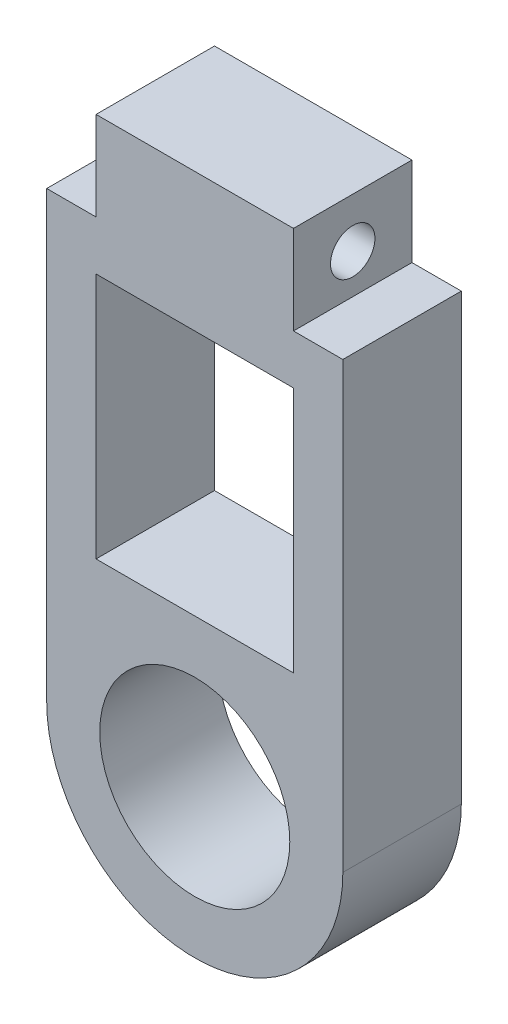
ISO-10303-21;
HEADER;
FILE_DESCRIPTION(('STEP AP214'),'2;1');
FILE_NAME('part.step','',(''),(''),'','','');
FILE_SCHEMA(('AUTOMOTIVE_DESIGN { 1 0 10303 214 1 1 1 1 }'));
ENDSEC;
DATA;
#1=APPLICATION_CONTEXT('core data for automotive mechanical design processes');
#2=APPLICATION_PROTOCOL_DEFINITION('international standard','automotive_design',2000,#1);
#3=PRODUCT_CONTEXT('',#1,'mechanical');
#4=PRODUCT('Part','Part','',(#3));
#5=PRODUCT_RELATED_PRODUCT_CATEGORY('part','',(#4));
#6=PRODUCT_DEFINITION_FORMATION('','',#4);
#7=PRODUCT_DEFINITION_CONTEXT('part definition',#1,'design');
#8=PRODUCT_DEFINITION('design','',#6,#7);
#9=PRODUCT_DEFINITION_SHAPE('','',#8);
#10=(LENGTH_UNIT() NAMED_UNIT(*) SI_UNIT(.MILLI.,.METRE.));
#11=(NAMED_UNIT(*) PLANE_ANGLE_UNIT() SI_UNIT($,.RADIAN.));
#12=(NAMED_UNIT(*) SI_UNIT($,.STERADIAN.) SOLID_ANGLE_UNIT());
#13=UNCERTAINTY_MEASURE_WITH_UNIT(LENGTH_MEASURE(1.E-05),#10,'distance_accuracy_value','');
#14=(GEOMETRIC_REPRESENTATION_CONTEXT(3) GLOBAL_UNCERTAINTY_ASSIGNED_CONTEXT((#13)) GLOBAL_UNIT_ASSIGNED_CONTEXT((#10,
#11,#12)) REPRESENTATION_CONTEXT('',''));
#15=CARTESIAN_POINT('',(0.,0.,0.));
#16=DIRECTION('',(0.,0.,1.));
#17=DIRECTION('',(1.,0.,0.));
#18=AXIS2_PLACEMENT_3D('',#15,#16,#17);
#19=CARTESIAN_POINT('',(0.,-47.5059057845326,12.));
#20=DIRECTION('',(0.,0.,1.));
#21=DIRECTION('',(1.,0.,0.));
#22=AXIS2_PLACEMENT_3D('',#19,#20,#21);
#23=PLANE('',#22);
#24=DIRECTION('',(1.,0.,0.));
#25=VECTOR('',#24,1.);
#26=CARTESIAN_POINT('',(-10.,-32.5059057845326,12.));
#27=LINE('',#26,#25);
#28=CARTESIAN_POINT('',(-10.,-32.5059057845326,12.));
#29=VERTEX_POINT('',#28);
#30=CARTESIAN_POINT('',(10.,-32.5059057845326,12.));
#31=VERTEX_POINT('',#30);
#32=EDGE_CURVE('E131',#29,#31,#27,.T.);
#33=ORIENTED_EDGE('',*,*,#32,.F.);
#34=DIRECTION('',(0.,-1.,0.));
#35=VECTOR('',#34,1.);
#36=CARTESIAN_POINT('',(-10.,-7.50590578453262,12.));
#37=LINE('',#36,#35);
#38=CARTESIAN_POINT('',(-10.,-7.50590578453262,12.));
#39=VERTEX_POINT('',#38);
#40=EDGE_CURVE('E123',#39,#29,#37,.T.);
#41=ORIENTED_EDGE('',*,*,#40,.F.);
#42=DIRECTION('',(-1.,0.,0.));
#43=VECTOR('',#42,1.);
#44=CARTESIAN_POINT('',(-10.,-7.50590578453262,12.));
#45=LINE('',#44,#43);
#46=CARTESIAN_POINT('',(10.,-7.50590578453262,12.));
#47=VERTEX_POINT('',#46);
#48=EDGE_CURVE('E146',#47,#39,#45,.T.);
#49=ORIENTED_EDGE('',*,*,#48,.F.);
#50=DIRECTION('',(0.,1.,0.));
#51=VECTOR('',#50,1.);
#52=CARTESIAN_POINT('',(10.,-7.50590578453262,12.));
#53=LINE('',#52,#51);
#54=EDGE_CURVE('E144',#31,#47,#53,.T.);
#55=ORIENTED_EDGE('',*,*,#54,.F.);
#56=EDGE_LOOP('',(#33,#41,#49,#55));
#57=FACE_BOUND('',#56,.T.);
#58=DIRECTION('',(-1.,0.,0.));
#59=VECTOR('',#58,1.);
#60=CARTESIAN_POINT('',(-15.,-2.50590578453262,12.));
#61=LINE('',#60,#59);
#62=CARTESIAN_POINT('',(-10.,-2.50590578453262,12.));
#63=VERTEX_POINT('',#62);
#64=CARTESIAN_POINT('',(-15.,-2.50590578453262,12.));
#65=VERTEX_POINT('',#64);
#66=EDGE_CURVE('E162',#63,#65,#61,.T.);
#67=ORIENTED_EDGE('',*,*,#66,.T.);
#68=DIRECTION('',(0.,-1.,0.));
#69=VECTOR('',#68,1.);
#70=CARTESIAN_POINT('',(-15.,-2.50590578453262,12.));
#71=LINE('',#70,#69);
#72=CARTESIAN_POINT('',(-15.,-47.5059057845326,12.));
#73=VERTEX_POINT('',#72);
#74=EDGE_CURVE('E165',#65,#73,#71,.T.);
#75=ORIENTED_EDGE('',*,*,#74,.T.);
#76=CARTESIAN_POINT('',(0.,-47.5059057845326,12.));
#77=DIRECTION('',(0.,0.,1.));
#78=DIRECTION('',(1.,0.,0.));
#79=AXIS2_PLACEMENT_3D('',#76,#77,#78);
#80=CIRCLE('',#79,15.);
#81=CARTESIAN_POINT('',(15.,-47.5059057845326,12.));
#82=VERTEX_POINT('',#81);
#83=EDGE_CURVE('E168',#73,#82,#80,.T.);
#84=ORIENTED_EDGE('',*,*,#83,.T.);
#85=DIRECTION('',(0.,1.,0.));
#86=VECTOR('',#85,1.);
#87=CARTESIAN_POINT('',(15.,-2.50590578453262,12.));
#88=LINE('',#87,#86);
#89=CARTESIAN_POINT('',(15.,-2.50590578453262,12.));
#90=VERTEX_POINT('',#89);
#91=EDGE_CURVE('E170',#82,#90,#88,.T.);
#92=ORIENTED_EDGE('',*,*,#91,.T.);
#93=DIRECTION('',(-1.,0.,0.));
#94=VECTOR('',#93,1.);
#95=CARTESIAN_POINT('',(10.,-2.50590578453262,12.));
#96=LINE('',#95,#94);
#97=CARTESIAN_POINT('',(10.,-2.50590578453262,12.));
#98=VERTEX_POINT('',#97);
#99=EDGE_CURVE('E172',#90,#98,#96,.T.);
#100=ORIENTED_EDGE('',*,*,#99,.T.);
#101=DIRECTION('',(0.,1.,0.));
#102=VECTOR('',#101,1.);
#103=CARTESIAN_POINT('',(10.,6.49409421546738,12.));
#104=LINE('',#103,#102);
#105=CARTESIAN_POINT('',(10.,6.49409421546738,12.));
#106=VERTEX_POINT('',#105);
#107=EDGE_CURVE('E174',#98,#106,#104,.T.);
#108=ORIENTED_EDGE('',*,*,#107,.T.);
#109=DIRECTION('',(-1.,0.,0.));
#110=VECTOR('',#109,1.);
#111=CARTESIAN_POINT('',(-10.,6.49409421546738,12.));
#112=LINE('',#111,#110);
#113=CARTESIAN_POINT('',(-10.,6.49409421546738,12.));
#114=VERTEX_POINT('',#113);
#115=EDGE_CURVE('E176',#106,#114,#112,.T.);
#116=ORIENTED_EDGE('',*,*,#115,.T.);
#117=DIRECTION('',(0.,-1.,0.));
#118=VECTOR('',#117,1.);
#119=CARTESIAN_POINT('',(-10.,-2.50590578453262,12.));
#120=LINE('',#119,#118);
#121=EDGE_CURVE('E178',#114,#63,#120,.T.);
#122=ORIENTED_EDGE('',*,*,#121,.T.);
#123=EDGE_LOOP('',(#67,#75,#84,#92,#100,#108,#116,#122));
#124=FACE_BOUND('',#123,.T.);
#125=CARTESIAN_POINT('',(0.,-47.5059057845326,12.));
#126=DIRECTION('',(0.,0.,1.));
#127=DIRECTION('',(1.,0.,0.));
#128=AXIS2_PLACEMENT_3D('',#125,#126,#127);
#129=CIRCLE('',#128,9.625);
#130=CARTESIAN_POINT('',(9.625,-47.5059057845326,12.));
#131=VERTEX_POINT('',#130);
#132=EDGE_CURVE('E152',#131,#131,#129,.T.);
#133=ORIENTED_EDGE('',*,*,#132,.F.);
#134=EDGE_LOOP('',(#133));
#135=FACE_BOUND('',#134,.T.);
#136=ADVANCED_FACE('F33',(#57,#124,#135),#23,.T.);
#137=CARTESIAN_POINT('',(0.,-47.5059057845326,0.));
#138=DIRECTION('',(0.,0.,1.));
#139=DIRECTION('',(1.,0.,0.));
#140=AXIS2_PLACEMENT_3D('',#137,#138,#139);
#141=PLANE('',#140);
#142=DIRECTION('',(-1.,0.,0.));
#143=VECTOR('',#142,1.);
#144=CARTESIAN_POINT('',(-15.,-2.50590578453262,0.));
#145=LINE('',#144,#143);
#146=CARTESIAN_POINT('',(-10.,-2.50590578453262,0.));
#147=VERTEX_POINT('',#146);
#148=CARTESIAN_POINT('',(-15.,-2.50590578453262,0.));
#149=VERTEX_POINT('',#148);
#150=EDGE_CURVE('E139',#147,#149,#145,.T.);
#151=ORIENTED_EDGE('',*,*,#150,.F.);
#152=DIRECTION('',(0.,-1.,0.));
#153=VECTOR('',#152,1.);
#154=CARTESIAN_POINT('',(-10.,-2.50590578453262,0.));
#155=LINE('',#154,#153);
#156=CARTESIAN_POINT('',(-10.,6.49409421546738,0.));
#157=VERTEX_POINT('',#156);
#158=EDGE_CURVE('E166',#157,#147,#155,.T.);
#159=ORIENTED_EDGE('',*,*,#158,.F.);
#160=DIRECTION('',(-1.,0.,0.));
#161=VECTOR('',#160,1.);
#162=CARTESIAN_POINT('',(-10.,6.49409421546738,0.));
#163=LINE('',#162,#161);
#164=CARTESIAN_POINT('',(10.,6.49409421546738,0.));
#165=VERTEX_POINT('',#164);
#166=EDGE_CURVE('E193',#165,#157,#163,.T.);
#167=ORIENTED_EDGE('',*,*,#166,.F.);
#168=DIRECTION('',(0.,1.,0.));
#169=VECTOR('',#168,1.);
#170=CARTESIAN_POINT('',(10.,6.49409421546738,0.));
#171=LINE('',#170,#169);
#172=CARTESIAN_POINT('',(10.,-2.50590578453262,0.));
#173=VERTEX_POINT('',#172);
#174=EDGE_CURVE('E191',#173,#165,#171,.T.);
#175=ORIENTED_EDGE('',*,*,#174,.F.);
#176=DIRECTION('',(-1.,0.,0.));
#177=VECTOR('',#176,1.);
#178=CARTESIAN_POINT('',(10.,-2.50590578453262,0.));
#179=LINE('',#178,#177);
#180=CARTESIAN_POINT('',(15.,-2.50590578453262,0.));
#181=VERTEX_POINT('',#180);
#182=EDGE_CURVE('E189',#181,#173,#179,.T.);
#183=ORIENTED_EDGE('',*,*,#182,.F.);
#184=DIRECTION('',(0.,1.,0.));
#185=VECTOR('',#184,1.);
#186=CARTESIAN_POINT('',(15.,-2.50590578453262,0.));
#187=LINE('',#186,#185);
#188=CARTESIAN_POINT('',(15.,-47.5059057845326,0.));
#189=VERTEX_POINT('',#188);
#190=EDGE_CURVE('E187',#189,#181,#187,.T.);
#191=ORIENTED_EDGE('',*,*,#190,.F.);
#192=CARTESIAN_POINT('',(0.,-47.5059057845326,0.));
#193=DIRECTION('',(0.,0.,1.));
#194=DIRECTION('',(1.,0.,0.));
#195=AXIS2_PLACEMENT_3D('',#192,#193,#194);
#196=CIRCLE('',#195,15.);
#197=CARTESIAN_POINT('',(-15.,-47.5059057845326,0.));
#198=VERTEX_POINT('',#197);
#199=EDGE_CURVE('E185',#198,#189,#196,.T.);
#200=ORIENTED_EDGE('',*,*,#199,.F.);
#201=DIRECTION('',(0.,-1.,0.));
#202=VECTOR('',#201,1.);
#203=CARTESIAN_POINT('',(-15.,-2.50590578453262,0.));
#204=LINE('',#203,#202);
#205=EDGE_CURVE('E183',#149,#198,#204,.T.);
#206=ORIENTED_EDGE('',*,*,#205,.F.);
#207=EDGE_LOOP('',(#151,#159,#167,#175,#183,#191,#200,#206));
#208=FACE_BOUND('',#207,.T.);
#209=DIRECTION('',(0.,-1.,0.));
#210=VECTOR('',#209,1.);
#211=CARTESIAN_POINT('',(-10.,-7.50590578453262,0.));
#212=LINE('',#211,#210);
#213=CARTESIAN_POINT('',(-10.,-7.50590578453262,0.));
#214=VERTEX_POINT('',#213);
#215=CARTESIAN_POINT('',(-10.,-32.5059057845326,0.));
#216=VERTEX_POINT('',#215);
#217=EDGE_CURVE('E57',#214,#216,#212,.T.);
#218=ORIENTED_EDGE('',*,*,#217,.T.);
#219=DIRECTION('',(1.,0.,0.));
#220=VECTOR('',#219,1.);
#221=CARTESIAN_POINT('',(-10.,-32.5059057845326,0.));
#222=LINE('',#221,#220);
#223=CARTESIAN_POINT('',(10.,-32.5059057845326,0.));
#224=VERTEX_POINT('',#223);
#225=EDGE_CURVE('E138',#216,#224,#222,.T.);
#226=ORIENTED_EDGE('',*,*,#225,.T.);
#227=DIRECTION('',(0.,1.,0.));
#228=VECTOR('',#227,1.);
#229=CARTESIAN_POINT('',(10.,-7.50590578453262,0.));
#230=LINE('',#229,#228);
#231=CARTESIAN_POINT('',(10.,-7.50590578453262,0.));
#232=VERTEX_POINT('',#231);
#233=EDGE_CURVE('E154',#224,#232,#230,.T.);
#234=ORIENTED_EDGE('',*,*,#233,.T.);
#235=DIRECTION('',(-1.,0.,0.));
#236=VECTOR('',#235,1.);
#237=CARTESIAN_POINT('',(-10.,-7.50590578453262,0.));
#238=LINE('',#237,#236);
#239=EDGE_CURVE('E132',#232,#214,#238,.T.);
#240=ORIENTED_EDGE('',*,*,#239,.T.);
#241=EDGE_LOOP('',(#218,#226,#234,#240));
#242=FACE_BOUND('',#241,.T.);
#243=CARTESIAN_POINT('',(0.,-47.5059057845326,0.));
#244=DIRECTION('',(0.,0.,1.));
#245=DIRECTION('',(1.,0.,0.));
#246=AXIS2_PLACEMENT_3D('',#243,#244,#245);
#247=CIRCLE('',#246,9.625);
#248=CARTESIAN_POINT('',(9.625,-47.5059057845326,0.));
#249=VERTEX_POINT('',#248);
#250=EDGE_CURVE('E282',#249,#249,#247,.T.);
#251=ORIENTED_EDGE('',*,*,#250,.T.);
#252=EDGE_LOOP('',(#251));
#253=FACE_BOUND('',#252,.T.);
#254=ADVANCED_FACE('F224',(#208,#242,#253),#141,.F.);
#255=CARTESIAN_POINT('',(-15.,-2.50590578453262,12.));
#256=DIRECTION('',(0.,-1.,0.));
#257=DIRECTION('',(0.,0.,-1.));
#258=AXIS2_PLACEMENT_3D('',#255,#256,#257);
#259=PLANE('',#258);
#260=ORIENTED_EDGE('',*,*,#150,.T.);
#261=DIRECTION('',(0.,0.,-1.));
#262=VECTOR('',#261,1.);
#263=CARTESIAN_POINT('',(-15.,-2.50590578453262,12.));
#264=LINE('',#263,#262);
#265=EDGE_CURVE('E11',#65,#149,#264,.T.);
#266=ORIENTED_EDGE('',*,*,#265,.F.);
#267=ORIENTED_EDGE('',*,*,#66,.F.);
#268=DIRECTION('',(0.,0.,-1.));
#269=VECTOR('',#268,1.);
#270=CARTESIAN_POINT('',(-10.,-2.50590578453262,12.));
#271=LINE('',#270,#269);
#272=EDGE_CURVE('E180',#63,#147,#271,.T.);
#273=ORIENTED_EDGE('',*,*,#272,.T.);
#274=EDGE_LOOP('',(#260,#266,#267,#273));
#275=FACE_BOUND('',#274,.T.);
#276=ADVANCED_FACE('F35',(#275),#259,.F.);
#277=CARTESIAN_POINT('',(-15.,-2.50590578453262,12.));
#278=DIRECTION('',(1.,0.,0.));
#279=DIRECTION('',(0.,0.,-1.));
#280=AXIS2_PLACEMENT_3D('',#277,#278,#279);
#281=PLANE('',#280);
#282=ORIENTED_EDGE('',*,*,#205,.T.);
#283=DIRECTION('',(0.,0.,-1.));
#284=VECTOR('',#283,1.);
#285=CARTESIAN_POINT('',(-15.,-47.5059057845326,12.));
#286=LINE('',#285,#284);
#287=EDGE_CURVE('E42',#73,#198,#286,.T.);
#288=ORIENTED_EDGE('',*,*,#287,.F.);
#289=ORIENTED_EDGE('',*,*,#74,.F.);
#290=ORIENTED_EDGE('',*,*,#265,.T.);
#291=EDGE_LOOP('',(#282,#288,#289,#290));
#292=FACE_BOUND('',#291,.T.);
#293=ADVANCED_FACE('F241',(#292),#281,.F.);
#294=CARTESIAN_POINT('',(0.,-47.5059057845326,12.));
#295=DIRECTION('',(0.,0.,-1.));
#296=DIRECTION('',(-1.,0.,0.));
#297=AXIS2_PLACEMENT_3D('',#294,#295,#296);
#298=CYLINDRICAL_SURFACE('',#297,15.);
#299=ORIENTED_EDGE('',*,*,#199,.T.);
#300=DIRECTION('',(0.,0.,-1.));
#301=VECTOR('',#300,1.);
#302=CARTESIAN_POINT('',(15.,-47.5059057845326,12.));
#303=LINE('',#302,#301);
#304=EDGE_CURVE('E210',#82,#189,#303,.T.);
#305=ORIENTED_EDGE('',*,*,#304,.F.);
#306=ORIENTED_EDGE('',*,*,#83,.F.);
#307=ORIENTED_EDGE('',*,*,#287,.T.);
#308=EDGE_LOOP('',(#299,#305,#306,#307));
#309=FACE_BOUND('',#308,.T.);
#310=ADVANCED_FACE('F218',(#309),#298,.T.);
#311=CARTESIAN_POINT('',(15.,-2.50590578453262,12.));
#312=DIRECTION('',(-1.,0.,0.));
#313=DIRECTION('',(0.,0.,1.));
#314=AXIS2_PLACEMENT_3D('',#311,#312,#313);
#315=PLANE('',#314);
#316=ORIENTED_EDGE('',*,*,#190,.T.);
#317=DIRECTION('',(0.,0.,-1.));
#318=VECTOR('',#317,1.);
#319=CARTESIAN_POINT('',(15.,-2.50590578453262,12.));
#320=LINE('',#319,#318);
#321=EDGE_CURVE('E207',#90,#181,#320,.T.);
#322=ORIENTED_EDGE('',*,*,#321,.F.);
#323=ORIENTED_EDGE('',*,*,#91,.F.);
#324=ORIENTED_EDGE('',*,*,#304,.T.);
#325=EDGE_LOOP('',(#316,#322,#323,#324));
#326=FACE_BOUND('',#325,.T.);
#327=ADVANCED_FACE('F230',(#326),#315,.F.);
#328=CARTESIAN_POINT('',(10.,-2.50590578453262,12.));
#329=DIRECTION('',(0.,-1.,0.));
#330=DIRECTION('',(0.,0.,-1.));
#331=AXIS2_PLACEMENT_3D('',#328,#329,#330);
#332=PLANE('',#331);
#333=ORIENTED_EDGE('',*,*,#182,.T.);
#334=DIRECTION('',(0.,0.,-1.));
#335=VECTOR('',#334,1.);
#336=CARTESIAN_POINT('',(10.,-2.50590578453262,12.));
#337=LINE('',#336,#335);
#338=EDGE_CURVE('E204',#98,#173,#337,.T.);
#339=ORIENTED_EDGE('',*,*,#338,.F.);
#340=ORIENTED_EDGE('',*,*,#99,.F.);
#341=ORIENTED_EDGE('',*,*,#321,.T.);
#342=EDGE_LOOP('',(#333,#339,#340,#341));
#343=FACE_BOUND('',#342,.T.);
#344=ADVANCED_FACE('F234',(#343),#332,.F.);
#345=CARTESIAN_POINT('',(10.,6.49409421546738,12.));
#346=DIRECTION('',(-1.,0.,0.));
#347=DIRECTION('',(0.,-1.,0.));
#348=AXIS2_PLACEMENT_3D('',#345,#346,#347);
#349=PLANE('',#348);
#350=CARTESIAN_POINT('',(10.,1.49409421546738,6.));
#351=DIRECTION('',(1.,0.,0.));
#352=DIRECTION('',(0.,1.,0.));
#353=AXIS2_PLACEMENT_3D('',#350,#351,#352);
#354=CIRCLE('',#353,2.25);
#355=CARTESIAN_POINT('',(10.,3.74409421546738,6.));
#356=VERTEX_POINT('',#355);
#357=EDGE_CURVE('E283',#356,#356,#354,.T.);
#358=ORIENTED_EDGE('',*,*,#357,.F.);
#359=EDGE_LOOP('',(#358));
#360=FACE_BOUND('',#359,.T.);
#361=ORIENTED_EDGE('',*,*,#174,.T.);
#362=DIRECTION('',(0.,0.,-1.));
#363=VECTOR('',#362,1.);
#364=CARTESIAN_POINT('',(10.,6.49409421546738,12.));
#365=LINE('',#364,#363);
#366=EDGE_CURVE('E201',#106,#165,#365,.T.);
#367=ORIENTED_EDGE('',*,*,#366,.F.);
#368=ORIENTED_EDGE('',*,*,#107,.F.);
#369=ORIENTED_EDGE('',*,*,#338,.T.);
#370=EDGE_LOOP('',(#361,#367,#368,#369));
#371=FACE_BOUND('',#370,.T.);
#372=ADVANCED_FACE('F254',(#360,#371),#349,.F.);
#373=CARTESIAN_POINT('',(-10.,6.49409421546738,12.));
#374=DIRECTION('',(0.,-1.,0.));
#375=DIRECTION('',(0.,0.,-1.));
#376=AXIS2_PLACEMENT_3D('',#373,#374,#375);
#377=PLANE('',#376);
#378=ORIENTED_EDGE('',*,*,#166,.T.);
#379=DIRECTION('',(0.,0.,-1.));
#380=VECTOR('',#379,1.);
#381=CARTESIAN_POINT('',(-10.,6.49409421546738,12.));
#382=LINE('',#381,#380);
#383=EDGE_CURVE('E198',#114,#157,#382,.T.);
#384=ORIENTED_EDGE('',*,*,#383,.F.);
#385=ORIENTED_EDGE('',*,*,#115,.F.);
#386=ORIENTED_EDGE('',*,*,#366,.T.);
#387=EDGE_LOOP('',(#378,#384,#385,#386));
#388=FACE_BOUND('',#387,.T.);
#389=ADVANCED_FACE('F252',(#388),#377,.F.);
#390=CARTESIAN_POINT('',(-10.,-2.50590578453262,12.));
#391=DIRECTION('',(1.,0.,0.));
#392=DIRECTION('',(0.,0.,-1.));
#393=AXIS2_PLACEMENT_3D('',#390,#391,#392);
#394=PLANE('',#393);
#395=CARTESIAN_POINT('',(-10.,1.49409421546739,6.));
#396=DIRECTION('',(1.,0.,0.));
#397=DIRECTION('',(0.,0.,-1.));
#398=AXIS2_PLACEMENT_3D('',#395,#396,#397);
#399=CIRCLE('',#398,2.25);
#400=CARTESIAN_POINT('',(-10.,3.74409421546739,6.));
#401=VERTEX_POINT('',#400);
#402=EDGE_CURVE('E37',#401,#401,#399,.T.);
#403=ORIENTED_EDGE('',*,*,#402,.T.);
#404=EDGE_LOOP('',(#403));
#405=FACE_BOUND('',#404,.T.);
#406=ORIENTED_EDGE('',*,*,#158,.T.);
#407=ORIENTED_EDGE('',*,*,#272,.F.);
#408=ORIENTED_EDGE('',*,*,#121,.F.);
#409=ORIENTED_EDGE('',*,*,#383,.T.);
#410=EDGE_LOOP('',(#406,#407,#408,#409));
#411=FACE_BOUND('',#410,.T.);
#412=ADVANCED_FACE('F247',(#405,#411),#394,.F.);
#413=CARTESIAN_POINT('',(-10.,-7.50590578453262,12.));
#414=DIRECTION('',(1.,0.,0.));
#415=DIRECTION('',(0.,1.,0.));
#416=AXIS2_PLACEMENT_3D('',#413,#414,#415);
#417=PLANE('',#416);
#418=ORIENTED_EDGE('',*,*,#217,.F.);
#419=DIRECTION('',(0.,0.,-1.));
#420=VECTOR('',#419,1.);
#421=CARTESIAN_POINT('',(-10.,-7.50590578453262,12.));
#422=LINE('',#421,#420);
#423=EDGE_CURVE('E127',#39,#214,#422,.T.);
#424=ORIENTED_EDGE('',*,*,#423,.F.);
#425=ORIENTED_EDGE('',*,*,#40,.T.);
#426=DIRECTION('',(0.,0.,-1.));
#427=VECTOR('',#426,1.);
#428=CARTESIAN_POINT('',(-10.,-32.5059057845326,12.));
#429=LINE('',#428,#427);
#430=EDGE_CURVE('E126',#29,#216,#429,.T.);
#431=ORIENTED_EDGE('',*,*,#430,.T.);
#432=EDGE_LOOP('',(#418,#424,#425,#431));
#433=FACE_BOUND('',#432,.T.);
#434=ADVANCED_FACE('F125',(#433),#417,.T.);
#435=CARTESIAN_POINT('',(-10.,-32.5059057845326,12.));
#436=DIRECTION('',(0.,1.,0.));
#437=DIRECTION('',(0.,0.,1.));
#438=AXIS2_PLACEMENT_3D('',#435,#436,#437);
#439=PLANE('',#438);
#440=ORIENTED_EDGE('',*,*,#225,.F.);
#441=ORIENTED_EDGE('',*,*,#430,.F.);
#442=ORIENTED_EDGE('',*,*,#32,.T.);
#443=DIRECTION('',(0.,0.,-1.));
#444=VECTOR('',#443,1.);
#445=CARTESIAN_POINT('',(10.,-32.5059057845326,12.));
#446=LINE('',#445,#444);
#447=EDGE_CURVE('E140',#31,#224,#446,.T.);
#448=ORIENTED_EDGE('',*,*,#447,.T.);
#449=EDGE_LOOP('',(#440,#441,#442,#448));
#450=FACE_BOUND('',#449,.T.);
#451=ADVANCED_FACE('F135',(#450),#439,.T.);
#452=CARTESIAN_POINT('',(10.,-7.50590578453262,12.));
#453=DIRECTION('',(-1.,0.,0.));
#454=DIRECTION('',(0.,-1.,0.));
#455=AXIS2_PLACEMENT_3D('',#452,#453,#454);
#456=PLANE('',#455);
#457=ORIENTED_EDGE('',*,*,#233,.F.);
#458=ORIENTED_EDGE('',*,*,#447,.F.);
#459=ORIENTED_EDGE('',*,*,#54,.T.);
#460=DIRECTION('',(0.,0.,-1.));
#461=VECTOR('',#460,1.);
#462=CARTESIAN_POINT('',(10.,-7.50590578453262,12.));
#463=LINE('',#462,#461);
#464=EDGE_CURVE('E49',#47,#232,#463,.T.);
#465=ORIENTED_EDGE('',*,*,#464,.T.);
#466=EDGE_LOOP('',(#457,#458,#459,#465));
#467=FACE_BOUND('',#466,.T.);
#468=ADVANCED_FACE('F305',(#467),#456,.T.);
#469=CARTESIAN_POINT('',(-10.,-7.50590578453262,12.));
#470=DIRECTION('',(0.,-1.,0.));
#471=DIRECTION('',(0.,0.,-1.));
#472=AXIS2_PLACEMENT_3D('',#469,#470,#471);
#473=PLANE('',#472);
#474=ORIENTED_EDGE('',*,*,#239,.F.);
#475=ORIENTED_EDGE('',*,*,#464,.F.);
#476=ORIENTED_EDGE('',*,*,#48,.T.);
#477=ORIENTED_EDGE('',*,*,#423,.T.);
#478=EDGE_LOOP('',(#474,#475,#476,#477));
#479=FACE_BOUND('',#478,.T.);
#480=ADVANCED_FACE('F296',(#479),#473,.T.);
#481=CARTESIAN_POINT('',(0.,-47.5059057845326,12.));
#482=DIRECTION('',(0.,0.,-1.));
#483=DIRECTION('',(-1.,0.,0.));
#484=AXIS2_PLACEMENT_3D('',#481,#482,#483);
#485=CYLINDRICAL_SURFACE('',#484,9.625);
#486=ORIENTED_EDGE('',*,*,#132,.T.);
#487=EDGE_LOOP('',(#486));
#488=FACE_BOUND('',#487,.T.);
#489=ORIENTED_EDGE('',*,*,#250,.F.);
#490=EDGE_LOOP('',(#489));
#491=FACE_BOUND('',#490,.T.);
#492=ADVANCED_FACE('F292',(#488,#491),#485,.F.);
#493=CARTESIAN_POINT('',(-15.,1.49409421546739,6.));
#494=DIRECTION('',(1.,0.,0.));
#495=DIRECTION('',(0.,1.,0.));
#496=AXIS2_PLACEMENT_3D('',#493,#494,#495);
#497=CYLINDRICAL_SURFACE('',#496,2.25);
#498=CARTESIAN_POINT('',(10.,3.74409421546738,6.));
#499=CARTESIAN_POINT('',(9.79166666666667,3.74409421546738,6.));
#500=CARTESIAN_POINT('',(9.58333333333333,3.74409421546738,6.));
#501=CARTESIAN_POINT('',(9.16666666666667,3.74409421546738,6.));
#502=CARTESIAN_POINT('',(8.95833333333333,3.74409421546738,6.));
#503=CARTESIAN_POINT('',(8.54166666666667,3.74409421546738,6.));
#504=CARTESIAN_POINT('',(8.33333333333333,3.74409421546739,6.));
#505=CARTESIAN_POINT('',(7.91666666666667,3.74409421546739,6.));
#506=CARTESIAN_POINT('',(7.70833333333333,3.74409421546739,6.));
#507=CARTESIAN_POINT('',(7.29166666666667,3.74409421546739,6.));
#508=CARTESIAN_POINT('',(7.08333333333333,3.74409421546739,6.));
#509=CARTESIAN_POINT('',(6.66666666666667,3.74409421546739,6.));
#510=CARTESIAN_POINT('',(6.45833333333334,3.74409421546739,6.));
#511=CARTESIAN_POINT('',(6.04166666666667,3.74409421546739,6.));
#512=CARTESIAN_POINT('',(5.83333333333334,3.74409421546739,6.));
#513=CARTESIAN_POINT('',(5.41666666666667,3.74409421546739,6.));
#514=CARTESIAN_POINT('',(5.20833333333333,3.74409421546739,6.));
#515=CARTESIAN_POINT('',(4.79166666666667,3.74409421546739,6.));
#516=CARTESIAN_POINT('',(4.58333333333333,3.74409421546739,6.));
#517=CARTESIAN_POINT('',(4.16666666666667,3.74409421546739,6.));
#518=CARTESIAN_POINT('',(3.95833333333333,3.74409421546739,6.));
#519=CARTESIAN_POINT('',(3.54166666666667,3.74409421546739,6.));
#520=CARTESIAN_POINT('',(3.33333333333334,3.74409421546739,6.));
#521=CARTESIAN_POINT('',(2.91666666666667,3.74409421546739,6.));
#522=CARTESIAN_POINT('',(2.70833333333334,3.74409421546739,6.));
#523=CARTESIAN_POINT('',(2.29166666666667,3.74409421546739,6.));
#524=CARTESIAN_POINT('',(2.08333333333334,3.74409421546739,6.));
#525=CARTESIAN_POINT('',(1.66666666666667,3.74409421546739,6.));
#526=CARTESIAN_POINT('',(1.45833333333333,3.74409421546739,6.));
#527=CARTESIAN_POINT('',(1.04166666666667,3.74409421546739,6.));
#528=CARTESIAN_POINT('',(0.833333333333335,3.74409421546739,6.));
#529=CARTESIAN_POINT('',(0.416666666666669,3.74409421546739,6.));
#530=CARTESIAN_POINT('',(0.208333333333335,3.74409421546739,6.));
#531=CARTESIAN_POINT('',(-0.208333333333332,3.74409421546739,6.));
#532=CARTESIAN_POINT('',(-0.416666666666665,3.74409421546739,6.));
#533=CARTESIAN_POINT('',(-0.833333333333332,3.74409421546739,6.));
#534=CARTESIAN_POINT('',(-1.04166666666667,3.74409421546739,6.));
#535=CARTESIAN_POINT('',(-1.45833333333333,3.74409421546739,6.));
#536=CARTESIAN_POINT('',(-1.66666666666667,3.74409421546739,6.));
#537=CARTESIAN_POINT('',(-2.08333333333333,3.74409421546739,6.));
#538=CARTESIAN_POINT('',(-2.29166666666667,3.74409421546739,6.));
#539=CARTESIAN_POINT('',(-2.70833333333333,3.74409421546739,6.));
#540=CARTESIAN_POINT('',(-2.91666666666667,3.74409421546739,6.));
#541=CARTESIAN_POINT('',(-3.33333333333333,3.74409421546739,6.));
#542=CARTESIAN_POINT('',(-3.54166666666667,3.74409421546739,6.));
#543=CARTESIAN_POINT('',(-3.95833333333333,3.74409421546739,6.));
#544=CARTESIAN_POINT('',(-4.16666666666667,3.74409421546739,6.));
#545=CARTESIAN_POINT('',(-4.58333333333333,3.74409421546739,6.));
#546=CARTESIAN_POINT('',(-4.79166666666667,3.74409421546739,6.));
#547=CARTESIAN_POINT('',(-5.20833333333333,3.74409421546739,6.));
#548=CARTESIAN_POINT('',(-5.41666666666667,3.74409421546739,6.));
#549=CARTESIAN_POINT('',(-5.83333333333333,3.74409421546739,6.));
#550=CARTESIAN_POINT('',(-6.04166666666667,3.74409421546739,6.));
#551=CARTESIAN_POINT('',(-6.45833333333333,3.74409421546739,6.));
#552=CARTESIAN_POINT('',(-6.66666666666667,3.74409421546739,6.));
#553=CARTESIAN_POINT('',(-7.08333333333333,3.74409421546739,6.));
#554=CARTESIAN_POINT('',(-7.29166666666667,3.74409421546739,6.));
#555=CARTESIAN_POINT('',(-7.70833333333333,3.74409421546739,6.));
#556=CARTESIAN_POINT('',(-7.91666666666666,3.74409421546739,6.));
#557=CARTESIAN_POINT('',(-8.33333333333333,3.74409421546739,6.));
#558=CARTESIAN_POINT('',(-8.54166666666666,3.74409421546739,6.));
#559=CARTESIAN_POINT('',(-8.95833333333333,3.74409421546739,6.));
#560=CARTESIAN_POINT('',(-9.16666666666666,3.74409421546739,6.));
#561=CARTESIAN_POINT('',(-9.58333333333333,3.74409421546739,6.));
#562=CARTESIAN_POINT('',(-9.79166666666667,3.74409421546739,6.));
#563=CARTESIAN_POINT('',(-10.,3.74409421546739,6.));
#564=B_SPLINE_CURVE_WITH_KNOTS('',3,(#498,#499,#500,#501,#502,#503,#504,#505,#506,#507,#508,
#509,#510,#511,#512,#513,#514,#515,#516,#517,#518,#519,#520,#521,#522,#523,#524,#525,#526,#527,
#528,#529,#530,#531,#532,#533,#534,#535,#536,#537,#538,#539,#540,#541,#542,#543,#544,#545,#546,
#547,#548,#549,#550,#551,#552,#553,#554,#555,#556,#557,#558,#559,#560,#561,#562,#563),
.UNSPECIFIED.,.F.,.F.,(4,2,2,2,2,2,2,2,2,2,2,2,2,2,2,2,2,2,2,2,2,2,2,2,2,2,2,2,2,2,2,2,4),(0.,
0.625000000000001,1.25,1.875,2.5,3.125,3.75,4.375,5.,5.625,6.25,6.875,7.5,8.125,8.75,9.375,10.,
10.625,11.25,11.875,12.5,13.125,13.75,14.375,15.,15.625,16.25,16.875,17.5,18.125,18.75,19.375,
20.),.UNSPECIFIED.);
#565=EDGE_CURVE('BSEAM295',#356,#401,#564,.T.);
#566=ORIENTED_EDGE('',*,*,#357,.T.);
#567=ORIENTED_EDGE('',*,*,#402,.F.);
#568=ORIENTED_EDGE('',*,*,#565,.T.);
#569=ORIENTED_EDGE('',*,*,#565,.F.);
#570=EDGE_LOOP('',(#566,#568,#567,#569));
#571=FACE_BOUND('',#570,.T.);
#572=ADVANCED_FACE('F295',(#571),#497,.F.);
#573=CLOSED_SHELL('',(#136,#254,#276,#293,#310,#327,#344,#372,#389,#412,#434,#451,#468,#480,
#492,#572));
#574=MANIFOLD_SOLID_BREP('B2',#573);
#575=ADVANCED_BREP_SHAPE_REPRESENTATION('',(#18,#574),#14);
#576=SHAPE_DEFINITION_REPRESENTATION(#9,#575);
ENDSEC;
END-ISO-10303-21;
